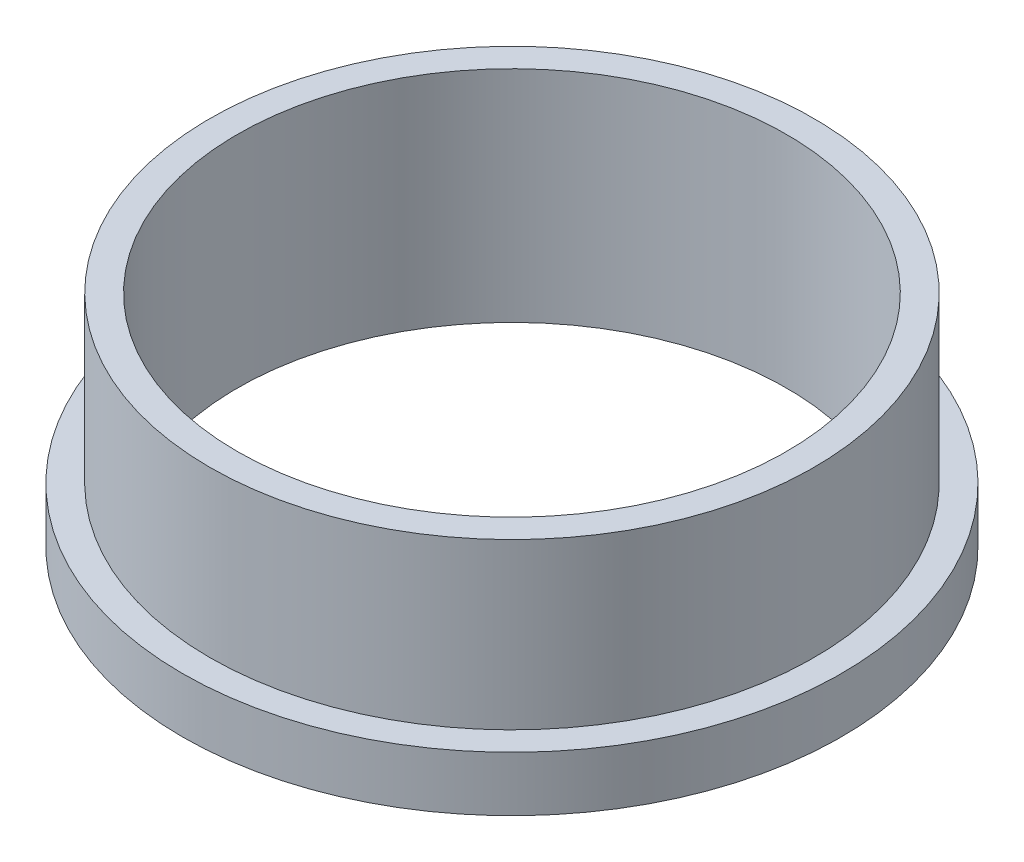
ISO-10303-21;
HEADER;
FILE_DESCRIPTION(('STEP AP214'),'2;1');
FILE_NAME('part.step','',(''),(''),'','','');
FILE_SCHEMA(('AUTOMOTIVE_DESIGN { 1 0 10303 214 1 1 1 1 }'));
ENDSEC;
DATA;
#1=APPLICATION_CONTEXT('core data for automotive mechanical design processes');
#2=APPLICATION_PROTOCOL_DEFINITION('international standard','automotive_design',2000,#1);
#3=PRODUCT_CONTEXT('',#1,'mechanical');
#4=PRODUCT('Part','Part','',(#3));
#5=PRODUCT_RELATED_PRODUCT_CATEGORY('part','',(#4));
#6=PRODUCT_DEFINITION_FORMATION('','',#4);
#7=PRODUCT_DEFINITION_CONTEXT('part definition',#1,'design');
#8=PRODUCT_DEFINITION('design','',#6,#7);
#9=PRODUCT_DEFINITION_SHAPE('','',#8);
#10=(LENGTH_UNIT() NAMED_UNIT(*) SI_UNIT(.MILLI.,.METRE.));
#11=(NAMED_UNIT(*) PLANE_ANGLE_UNIT() SI_UNIT($,.RADIAN.));
#12=(NAMED_UNIT(*) SI_UNIT($,.STERADIAN.) SOLID_ANGLE_UNIT());
#13=UNCERTAINTY_MEASURE_WITH_UNIT(LENGTH_MEASURE(1.E-05),#10,'distance_accuracy_value','');
#14=(GEOMETRIC_REPRESENTATION_CONTEXT(3) GLOBAL_UNCERTAINTY_ASSIGNED_CONTEXT((#13)) GLOBAL_UNIT_ASSIGNED_CONTEXT((#10,
#11,#12)) REPRESENTATION_CONTEXT('',''));
#15=CARTESIAN_POINT('',(0.,0.,0.));
#16=DIRECTION('',(0.,0.,1.));
#17=DIRECTION('',(1.,0.,0.));
#18=AXIS2_PLACEMENT_3D('',#15,#16,#17);
#19=CARTESIAN_POINT('',(0.,20.,0.));
#20=DIRECTION('',(0.,1.,0.));
#21=DIRECTION('',(0.,0.,1.));
#22=AXIS2_PLACEMENT_3D('',#19,#20,#21);
#23=PLANE('',#22);
#24=CARTESIAN_POINT('',(0.,20.,0.));
#25=DIRECTION('',(0.,1.,0.));
#26=DIRECTION('',(0.,0.,1.));
#27=AXIS2_PLACEMENT_3D('',#24,#25,#26);
#28=CIRCLE('',#27,25.);
#29=CARTESIAN_POINT('',(0.,20.,25.));
#30=VERTEX_POINT('',#29);
#31=EDGE_CURVE('E38',#30,#30,#28,.T.);
#32=ORIENTED_EDGE('',*,*,#31,.F.);
#33=EDGE_LOOP('',(#32));
#34=FACE_BOUND('',#33,.T.);
#35=CARTESIAN_POINT('',(0.,20.,0.));
#36=DIRECTION('',(0.,1.,0.));
#37=DIRECTION('',(0.,0.,1.));
#38=AXIS2_PLACEMENT_3D('',#35,#36,#37);
#39=CIRCLE('',#38,27.5);
#40=CARTESIAN_POINT('',(0.,20.,27.5));
#41=VERTEX_POINT('',#40);
#42=EDGE_CURVE('E49',#41,#41,#39,.T.);
#43=ORIENTED_EDGE('',*,*,#42,.T.);
#44=EDGE_LOOP('',(#43));
#45=FACE_BOUND('',#44,.T.);
#46=ADVANCED_FACE('F31',(#34,#45),#23,.T.);
#47=CARTESIAN_POINT('',(0.,20.,0.));
#48=DIRECTION('',(0.,-1.,0.));
#49=DIRECTION('',(0.,0.,-1.));
#50=AXIS2_PLACEMENT_3D('',#47,#48,#49);
#51=CYLINDRICAL_SURFACE('',#50,30.);
#52=CARTESIAN_POINT('',(0.,0.,0.));
#53=DIRECTION('',(0.,1.,0.));
#54=DIRECTION('',(0.,0.,1.));
#55=AXIS2_PLACEMENT_3D('',#52,#53,#54);
#56=CIRCLE('',#55,30.);
#57=CARTESIAN_POINT('',(0.,0.,30.));
#58=VERTEX_POINT('',#57);
#59=EDGE_CURVE('E10',#58,#58,#56,.T.);
#60=ORIENTED_EDGE('',*,*,#59,.T.);
#61=EDGE_LOOP('',(#60));
#62=FACE_BOUND('',#61,.T.);
#63=CARTESIAN_POINT('',(0.,5.,0.));
#64=DIRECTION('',(0.,1.,0.));
#65=DIRECTION('',(0.,0.,1.));
#66=AXIS2_PLACEMENT_3D('',#63,#64,#65);
#67=CIRCLE('',#66,30.);
#68=CARTESIAN_POINT('',(0.,5.,30.));
#69=VERTEX_POINT('',#68);
#70=EDGE_CURVE('E47',#69,#69,#67,.T.);
#71=ORIENTED_EDGE('',*,*,#70,.F.);
#72=EDGE_LOOP('',(#71));
#73=FACE_BOUND('',#72,.T.);
#74=ADVANCED_FACE('F33',(#62,#73),#51,.T.);
#75=CARTESIAN_POINT('',(0.,0.,0.));
#76=DIRECTION('',(0.,1.,0.));
#77=DIRECTION('',(0.,0.,1.));
#78=AXIS2_PLACEMENT_3D('',#75,#76,#77);
#79=PLANE('',#78);
#80=ORIENTED_EDGE('',*,*,#59,.F.);
#81=EDGE_LOOP('',(#80));
#82=FACE_BOUND('',#81,.T.);
#83=CARTESIAN_POINT('',(0.,0.,0.));
#84=DIRECTION('',(0.,1.,0.));
#85=DIRECTION('',(0.,0.,1.));
#86=AXIS2_PLACEMENT_3D('',#83,#84,#85);
#87=CIRCLE('',#86,25.);
#88=CARTESIAN_POINT('',(0.,0.,25.));
#89=VERTEX_POINT('',#88);
#90=EDGE_CURVE('E42',#89,#89,#87,.T.);
#91=ORIENTED_EDGE('',*,*,#90,.T.);
#92=EDGE_LOOP('',(#91));
#93=FACE_BOUND('',#92,.T.);
#94=ADVANCED_FACE('F68',(#82,#93),#79,.F.);
#95=CARTESIAN_POINT('',(0.,20.,0.));
#96=DIRECTION('',(0.,-1.,0.));
#97=DIRECTION('',(0.,0.,-1.));
#98=AXIS2_PLACEMENT_3D('',#95,#96,#97);
#99=CYLINDRICAL_SURFACE('',#98,25.);
#100=ORIENTED_EDGE('',*,*,#31,.T.);
#101=EDGE_LOOP('',(#100));
#102=FACE_BOUND('',#101,.T.);
#103=ORIENTED_EDGE('',*,*,#90,.F.);
#104=EDGE_LOOP('',(#103));
#105=FACE_BOUND('',#104,.T.);
#106=ADVANCED_FACE('F73',(#102,#105),#99,.F.);
#107=CARTESIAN_POINT('',(0.,5.,0.));
#108=DIRECTION('',(0.,1.,0.));
#109=DIRECTION('',(0.,0.,1.));
#110=AXIS2_PLACEMENT_3D('',#107,#108,#109);
#111=CYLINDRICAL_SURFACE('',#110,27.5);
#112=CARTESIAN_POINT('',(0.,5.,0.));
#113=DIRECTION('',(0.,1.,0.));
#114=DIRECTION('',(0.,0.,1.));
#115=AXIS2_PLACEMENT_3D('',#112,#113,#114);
#116=CIRCLE('',#115,27.5);
#117=CARTESIAN_POINT('',(0.,5.,27.5));
#118=VERTEX_POINT('',#117);
#119=EDGE_CURVE('E52',#118,#118,#116,.T.);
#120=ORIENTED_EDGE('',*,*,#119,.T.);
#121=EDGE_LOOP('',(#120));
#122=FACE_BOUND('',#121,.T.);
#123=ORIENTED_EDGE('',*,*,#42,.F.);
#124=EDGE_LOOP('',(#123));
#125=FACE_BOUND('',#124,.T.);
#126=ADVANCED_FACE('F58',(#122,#125),#111,.T.);
#127=CARTESIAN_POINT('',(0.,5.,0.));
#128=DIRECTION('',(0.,1.,0.));
#129=DIRECTION('',(0.,0.,1.));
#130=AXIS2_PLACEMENT_3D('',#127,#128,#129);
#131=PLANE('',#130);
#132=ORIENTED_EDGE('',*,*,#119,.F.);
#133=EDGE_LOOP('',(#132));
#134=FACE_BOUND('',#133,.T.);
#135=ORIENTED_EDGE('',*,*,#70,.T.);
#136=EDGE_LOOP('',(#135));
#137=FACE_BOUND('',#136,.T.);
#138=ADVANCED_FACE('F61',(#134,#137),#131,.T.);
#139=CLOSED_SHELL('',(#46,#74,#94,#106,#126,#138));
#140=MANIFOLD_SOLID_BREP('B2',#139);
#141=ADVANCED_BREP_SHAPE_REPRESENTATION('',(#18,#140),#14);
#142=SHAPE_DEFINITION_REPRESENTATION(#9,#141);
ENDSEC;
END-ISO-10303-21;
